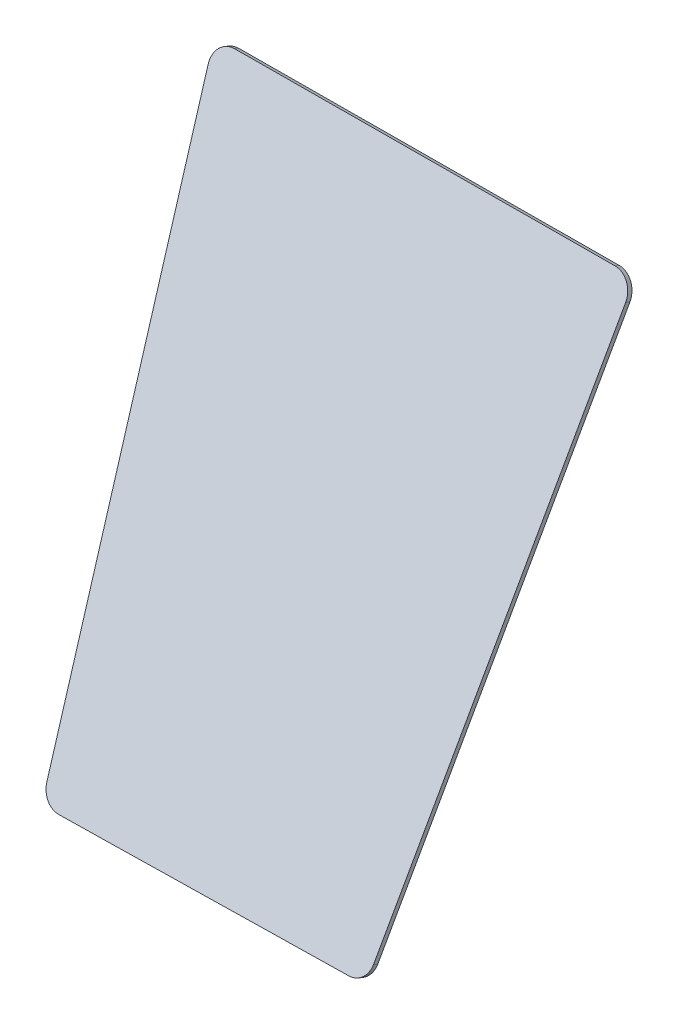
ISO-10303-21;
HEADER;
FILE_DESCRIPTION(('STEP AP214'),'2;1');
FILE_NAME('part.step','',(''),(''),'','','');
FILE_SCHEMA(('AUTOMOTIVE_DESIGN { 1 0 10303 214 1 1 1 1 }'));
ENDSEC;
DATA;
#1=APPLICATION_CONTEXT('core data for automotive mechanical design processes');
#2=APPLICATION_PROTOCOL_DEFINITION('international standard','automotive_design',2000,#1);
#3=PRODUCT_CONTEXT('',#1,'mechanical');
#4=PRODUCT('Part','Part','',(#3));
#5=PRODUCT_RELATED_PRODUCT_CATEGORY('part','',(#4));
#6=PRODUCT_DEFINITION_FORMATION('','',#4);
#7=PRODUCT_DEFINITION_CONTEXT('part definition',#1,'design');
#8=PRODUCT_DEFINITION('design','',#6,#7);
#9=PRODUCT_DEFINITION_SHAPE('','',#8);
#10=(LENGTH_UNIT() NAMED_UNIT(*) SI_UNIT(.MILLI.,.METRE.));
#11=(NAMED_UNIT(*) PLANE_ANGLE_UNIT() SI_UNIT($,.RADIAN.));
#12=(NAMED_UNIT(*) SI_UNIT($,.STERADIAN.) SOLID_ANGLE_UNIT());
#13=UNCERTAINTY_MEASURE_WITH_UNIT(LENGTH_MEASURE(1.E-05),#10,'distance_accuracy_value','');
#14=(GEOMETRIC_REPRESENTATION_CONTEXT(3) GLOBAL_UNCERTAINTY_ASSIGNED_CONTEXT((#13)) GLOBAL_UNIT_ASSIGNED_CONTEXT((#10,
#11,#12)) REPRESENTATION_CONTEXT('',''));
#15=CARTESIAN_POINT('',(0.,0.,0.));
#16=DIRECTION('',(0.,0.,1.));
#17=DIRECTION('',(1.,0.,0.));
#18=AXIS2_PLACEMENT_3D('',#15,#16,#17);
#19=CARTESIAN_POINT('',(110.678400741719,112.140813668601,1095.30690111298));
#20=DIRECTION('',(0.996346290988481,-0.0787889886641014,0.0329600318383585));
#21=DIRECTION('',(0.078831820313899,0.996887929561793,0.));
#22=AXIS2_PLACEMENT_3D('',#19,#20,#21);
#23=PLANE('',#22);
#24=DIRECTION('',(0.0854053185316787,0.919159579003186,-0.384514759005668));
#25=VECTOR('',#24,1.);
#26=CARTESIAN_POINT('',(110.678400741719,113.366124959349,1098.23593461241));
#27=LINE('',#26,#25);
#28=CARTESIAN_POINT('',(111.660031698682,123.930753868301,1093.8164019962));
#29=VERTEX_POINT('',#28);
#30=CARTESIAN_POINT('',(143.144317901316,462.774794833915,952.066767081115));
#31=VERTEX_POINT('',#30);
#32=EDGE_CURVE('E110',#29,#31,#27,.T.);
#33=ORIENTED_EDGE('',*,*,#32,.F.);
#34=DIRECTION('',(0.,0.385924815983597,0.922530236040005));
#35=VECTOR('',#34,1.);
#36=CARTESIAN_POINT('',(111.660031698682,122.705442577553,1090.88736849677));
#37=LINE('',#36,#35);
#38=CARTESIAN_POINT('',(111.660031698682,122.705442577553,1090.88736849677));
#39=VERTEX_POINT('',#38);
#40=EDGE_CURVE('E11',#29,#39,#37,.F.);
#41=ORIENTED_EDGE('',*,*,#40,.T.);
#42=DIRECTION('',(0.0854053185316787,0.919159579003186,-0.384514759005668));
#43=VECTOR('',#42,1.);
#44=CARTESIAN_POINT('',(110.678400741719,112.140813668601,1095.30690111298));
#45=LINE('',#44,#43);
#46=CARTESIAN_POINT('',(143.144317901316,461.549483543167,949.137733581688));
#47=VERTEX_POINT('',#46);
#48=EDGE_CURVE('E160',#39,#47,#45,.T.);
#49=ORIENTED_EDGE('',*,*,#48,.T.);
#50=DIRECTION('',(0.,0.385924815983597,0.922530236040005));
#51=VECTOR('',#50,1.);
#52=CARTESIAN_POINT('',(143.144317901316,461.549483543167,949.137733581688));
#53=LINE('',#52,#51);
#54=EDGE_CURVE('E47',#47,#31,#53,.T.);
#55=ORIENTED_EDGE('',*,*,#54,.T.);
#56=EDGE_LOOP('',(#33,#41,#49,#55));
#57=FACE_BOUND('',#56,.T.);
#58=ADVANCED_FACE('F39',(#57),#23,.T.);
#59=CARTESIAN_POINT('',(-110.678400741719,109.257154964133,1096.51323063087));
#60=DIRECTION('',(0.0141197524233254,-0.922438270224821,0.38588634365075));
#61=DIRECTION('',(0.,-0.385924815983597,-0.922530236040005));
#62=AXIS2_PLACEMENT_3D('',#59,#60,#61);
#63=PLANE('',#62);
#64=DIRECTION('',(0.999900311326836,0.013025898535917,-0.00544916285570541));
#65=VECTOR('',#64,1.);
#66=CARTESIAN_POINT('',(-110.678400741719,110.482466254881,1099.4422641303));
#67=LINE('',#66,#65);
#68=CARTESIAN_POINT('',(-98.8506150869359,110.636549151044,1099.37780617432));
#69=VERTEX_POINT('',#68);
#70=CARTESIAN_POINT('',(99.1857546589042,113.21640799248,1098.29856615621));
#71=VERTEX_POINT('',#70);
#72=EDGE_CURVE('E135',#69,#71,#67,.T.);
#73=ORIENTED_EDGE('',*,*,#72,.F.);
#74=DIRECTION('',(0.,0.385924815983597,0.922530236040005));
#75=VECTOR('',#74,1.);
#76=CARTESIAN_POINT('',(-98.8506150869359,109.411237860296,1096.44877267489));
#77=LINE('',#76,#75);
#78=CARTESIAN_POINT('',(-98.8506150869359,109.411237860296,1096.44877267489));
#79=VERTEX_POINT('',#78);
#80=EDGE_CURVE('E61',#69,#79,#77,.F.);
#81=ORIENTED_EDGE('',*,*,#80,.T.);
#82=DIRECTION('',(0.999900311326836,0.013025898535917,-0.00544916285570541));
#83=VECTOR('',#82,1.);
#84=CARTESIAN_POINT('',(-110.678400741719,109.257154964133,1096.51323063087));
#85=LINE('',#84,#83);
#86=CARTESIAN_POINT('',(99.1857546589042,111.991096701732,1095.36953265679));
#87=VERTEX_POINT('',#86);
#88=EDGE_CURVE('E129',#79,#87,#85,.T.);
#89=ORIENTED_EDGE('',*,*,#88,.T.);
#90=DIRECTION('',(0.,0.385924815983597,0.922530236040005));
#91=VECTOR('',#90,1.);
#92=CARTESIAN_POINT('',(99.1857546589042,111.991096701732,1095.36953265679));
#93=LINE('',#92,#91);
#94=EDGE_CURVE('E154',#87,#71,#93,.T.);
#95=ORIENTED_EDGE('',*,*,#94,.T.);
#96=EDGE_LOOP('',(#73,#81,#89,#95));
#97=FACE_BOUND('',#96,.T.);
#98=ADVANCED_FACE('F192',(#97),#63,.T.);
#99=CARTESIAN_POINT('',(-144.331189967627,473.141874622148,944.28825416173));
#100=DIRECTION('',(-0.996380216090595,-0.0784230196095746,0.0328069349158879));
#101=DIRECTION('',(0.0784652568585438,-0.99691684882247,0.));
#102=AXIS2_PLACEMENT_3D('',#99,#100,#101);
#103=PLANE('',#102);
#104=DIRECTION('',(0.0850086171117907,-0.919190875935648,0.384527851544459));
#105=VECTOR('',#104,1.);
#106=CARTESIAN_POINT('',(-144.331189967627,474.367185912896,947.217287661157));
#107=LINE('',#106,#105);
#108=CARTESIAN_POINT('',(-143.160769442987,461.711529300552,952.511566112382));
#109=VERTEX_POINT('',#108);
#110=CARTESIAN_POINT('',(-111.683964687063,121.355542833858,1094.89369768338));
#111=VERTEX_POINT('',#110);
#112=EDGE_CURVE('E125',#109,#111,#107,.T.);
#113=ORIENTED_EDGE('',*,*,#112,.F.);
#114=DIRECTION('',(0.,0.385924815983597,0.922530236040005));
#115=VECTOR('',#114,1.);
#116=CARTESIAN_POINT('',(-143.160769442987,460.486218009804,949.582532612955));
#117=LINE('',#116,#115);
#118=CARTESIAN_POINT('',(-143.160769442987,460.486218009804,949.582532612955));
#119=VERTEX_POINT('',#118);
#120=EDGE_CURVE('E146',#109,#119,#117,.F.);
#121=ORIENTED_EDGE('',*,*,#120,.T.);
#122=DIRECTION('',(0.0850086171117907,-0.919190875935648,0.384527851544459));
#123=VECTOR('',#122,1.);
#124=CARTESIAN_POINT('',(-144.331189967627,473.141874622148,944.28825416173));
#125=LINE('',#124,#123);
#126=CARTESIAN_POINT('',(-111.683964687063,120.13023154311,1091.96466418396));
#127=VERTEX_POINT('',#126);
#128=EDGE_CURVE('E132',#119,#127,#125,.T.);
#129=ORIENTED_EDGE('',*,*,#128,.T.);
#130=DIRECTION('',(0.,0.385924815983597,0.922530236040005));
#131=VECTOR('',#130,1.);
#132=CARTESIAN_POINT('',(-111.683964687063,120.13023154311,1091.96466418396));
#133=LINE('',#132,#131);
#134=EDGE_CURVE('E143',#127,#111,#133,.T.);
#135=ORIENTED_EDGE('',*,*,#134,.T.);
#136=EDGE_LOOP('',(#113,#121,#129,#135));
#137=FACE_BOUND('',#136,.T.);
#138=ADVANCED_FACE('F172',(#137),#103,.T.);
#139=CARTESIAN_POINT('',(144.331189967627,474.322983455774,943.79415739236));
#140=DIRECTION('',(-0.00443521675280644,0.922521162381143,-0.385921020172912));
#141=DIRECTION('',(0.,0.385924815983597,0.922530236040005));
#142=AXIS2_PLACEMENT_3D('',#139,#140,#141);
#143=PLANE('',#142);
#144=DIRECTION('',(-0.999990164377808,-0.00409162155785511,0.00171166020917419));
#145=VECTOR('',#144,1.);
#146=CARTESIAN_POINT('',(144.331189967627,474.322983455774,943.79415739236));
#147=LINE('',#146,#145);
#148=CARTESIAN_POINT('',(130.434392753002,474.266122461442,943.817944221145));
#149=VERTEX_POINT('',#148);
#150=CARTESIAN_POINT('',(-130.563067951397,473.198209121086,944.264687583327));
#151=VERTEX_POINT('',#150);
#152=EDGE_CURVE('E161',#149,#151,#147,.T.);
#153=ORIENTED_EDGE('',*,*,#152,.T.);
#154=DIRECTION('',(0.,0.385924815983597,0.922530236040005));
#155=VECTOR('',#154,1.);
#156=CARTESIAN_POINT('',(-130.563067951397,473.198209121086,944.264687583327));
#157=LINE('',#156,#155);
#158=CARTESIAN_POINT('',(-130.563067951397,474.423520411834,947.193721082754));
#159=VERTEX_POINT('',#158);
#160=EDGE_CURVE('E116',#151,#159,#157,.T.);
#161=ORIENTED_EDGE('',*,*,#160,.T.);
#162=DIRECTION('',(-0.999990164377808,-0.00409162155785511,0.00171166020917419));
#163=VECTOR('',#162,1.);
#164=CARTESIAN_POINT('',(144.331189967627,475.548294746521,946.723190891787));
#165=LINE('',#164,#163);
#166=CARTESIAN_POINT('',(130.434392753002,475.49143375219,946.746977720572));
#167=VERTEX_POINT('',#166);
#168=EDGE_CURVE('E108',#167,#159,#165,.T.);
#169=ORIENTED_EDGE('',*,*,#168,.F.);
#170=DIRECTION('',(0.,0.385924815983597,0.922530236040005));
#171=VECTOR('',#170,1.);
#172=CARTESIAN_POINT('',(130.434392753002,474.266122461442,943.817944221145));
#173=LINE('',#172,#171);
#174=EDGE_CURVE('E122',#167,#149,#173,.F.);
#175=ORIENTED_EDGE('',*,*,#174,.T.);
#176=EDGE_LOOP('',(#153,#161,#169,#175));
#177=FACE_BOUND('',#176,.T.);
#178=ADVANCED_FACE('F121',(#177),#143,.T.);
#179=CARTESIAN_POINT('',(0.,406.661195784957,972.099314162147));
#180=DIRECTION('',(0.,0.385924815983597,0.922530236040005));
#181=DIRECTION('',(0.,-0.922530236040005,0.385924815983597));
#182=AXIS2_PLACEMENT_3D('',#179,#180,#181);
#183=PLANE('',#182);
#184=ORIENTED_EDGE('',*,*,#128,.F.);
#185=CARTESIAN_POINT('',(-130.506740698636,461.482190358846,949.165884539523));
#186=DIRECTION('',(0.,0.385924815983597,0.922530236040005));
#187=DIRECTION('',(0.,-0.922530236040005,0.385924815983597));
#188=AXIS2_PLACEMENT_3D('',#185,#186,#187);
#189=CIRCLE('',#188,12.7);
#190=EDGE_CURVE('E152',#119,#151,#189,.F.);
#191=ORIENTED_EDGE('',*,*,#190,.T.);
#192=ORIENTED_EDGE('',*,*,#152,.F.);
#193=CARTESIAN_POINT('',(130.490720005763,462.550103699201,948.719141177341));
#194=DIRECTION('',(0.,0.385924815983597,0.922530236040005));
#195=DIRECTION('',(0.,-0.922530236040005,0.385924815983597));
#196=AXIS2_PLACEMENT_3D('',#193,#194,#195);
#197=CIRCLE('',#196,12.7);
#198=EDGE_CURVE('E128',#149,#47,#197,.F.);
#199=ORIENTED_EDGE('',*,*,#198,.T.);
#200=ORIENTED_EDGE('',*,*,#48,.F.);
#201=CARTESIAN_POINT('',(99.006433803128,123.706062733587,1090.46877609242));
#202=DIRECTION('',(0.,0.385924815983597,0.922530236040005));
#203=DIRECTION('',(0.,-0.922530236040005,0.385924815983597));
#204=AXIS2_PLACEMENT_3D('',#201,#202,#203);
#205=CIRCLE('',#204,12.7);
#206=EDGE_CURVE('E54',#39,#87,#205,.F.);
#207=ORIENTED_EDGE('',*,*,#206,.T.);
#208=ORIENTED_EDGE('',*,*,#88,.F.);
#209=CARTESIAN_POINT('',(-99.0299359427121,121.126203892151,1091.54801611052));
#210=DIRECTION('',(0.,0.385924815983597,0.922530236040005));
#211=DIRECTION('',(0.,-0.922530236040005,0.385924815983597));
#212=AXIS2_PLACEMENT_3D('',#209,#210,#211);
#213=CIRCLE('',#212,12.7);
#214=EDGE_CURVE('E150',#79,#127,#213,.F.);
#215=ORIENTED_EDGE('',*,*,#214,.T.);
#216=EDGE_LOOP('',(#184,#191,#192,#199,#200,#207,#208,#215));
#217=FACE_BOUND('',#216,.T.);
#218=ADVANCED_FACE('F178',(#217),#183,.F.);
#219=CARTESIAN_POINT('',(0.,407.886507075705,975.028347661574));
#220=DIRECTION('',(0.,0.385924815983597,0.922530236040005));
#221=DIRECTION('',(0.,-0.922530236040005,0.385924815983597));
#222=AXIS2_PLACEMENT_3D('',#219,#220,#221);
#223=PLANE('',#222);
#224=ORIENTED_EDGE('',*,*,#168,.T.);
#225=CARTESIAN_POINT('',(-130.506740698636,462.707501649594,952.09491803895));
#226=DIRECTION('',(0.,0.385924815983597,0.922530236040005));
#227=DIRECTION('',(0.,-0.922530236040005,0.385924815983597));
#228=AXIS2_PLACEMENT_3D('',#225,#226,#227);
#229=CIRCLE('',#228,12.7);
#230=EDGE_CURVE('E141',#159,#109,#229,.T.);
#231=ORIENTED_EDGE('',*,*,#230,.T.);
#232=ORIENTED_EDGE('',*,*,#112,.T.);
#233=CARTESIAN_POINT('',(-99.0299359427121,122.351515182899,1094.47704960995));
#234=DIRECTION('',(0.,0.385924815983597,0.922530236040005));
#235=DIRECTION('',(0.,-0.922530236040005,0.385924815983597));
#236=AXIS2_PLACEMENT_3D('',#233,#234,#235);
#237=CIRCLE('',#236,12.7);
#238=EDGE_CURVE('E139',#111,#69,#237,.T.);
#239=ORIENTED_EDGE('',*,*,#238,.T.);
#240=ORIENTED_EDGE('',*,*,#72,.T.);
#241=CARTESIAN_POINT('',(99.006433803128,124.931374024335,1093.39780959185));
#242=DIRECTION('',(0.,0.385924815983597,0.922530236040005));
#243=DIRECTION('',(0.,-0.922530236040005,0.385924815983597));
#244=AXIS2_PLACEMENT_3D('',#241,#242,#243);
#245=CIRCLE('',#244,12.7);
#246=EDGE_CURVE('E115',#71,#29,#245,.T.);
#247=ORIENTED_EDGE('',*,*,#246,.T.);
#248=ORIENTED_EDGE('',*,*,#32,.T.);
#249=CARTESIAN_POINT('',(130.490720005763,463.775414989949,951.648174676768));
#250=DIRECTION('',(0.,0.385924815983597,0.922530236040005));
#251=DIRECTION('',(0.,-0.922530236040005,0.385924815983597));
#252=AXIS2_PLACEMENT_3D('',#249,#250,#251);
#253=CIRCLE('',#252,12.7);
#254=EDGE_CURVE('E105',#31,#167,#253,.T.);
#255=ORIENTED_EDGE('',*,*,#254,.T.);
#256=EDGE_LOOP('',(#224,#231,#232,#239,#240,#247,#248,#255));
#257=FACE_BOUND('',#256,.T.);
#258=ADVANCED_FACE('F107',(#257),#223,.T.);
#259=CARTESIAN_POINT('',(-130.506740698636,461.482190358846,949.165884539523));
#260=DIRECTION('',(0.,0.385924815983597,0.922530236040005));
#261=DIRECTION('',(0.,-0.922530236040005,0.385924815983597));
#262=AXIS2_PLACEMENT_3D('',#259,#260,#261);
#263=CYLINDRICAL_SURFACE('',#262,12.7);
#264=ORIENTED_EDGE('',*,*,#190,.F.);
#265=ORIENTED_EDGE('',*,*,#120,.F.);
#266=ORIENTED_EDGE('',*,*,#230,.F.);
#267=ORIENTED_EDGE('',*,*,#160,.F.);
#268=EDGE_LOOP('',(#264,#265,#266,#267));
#269=FACE_BOUND('',#268,.T.);
#270=ADVANCED_FACE('F177',(#269),#263,.T.);
#271=CARTESIAN_POINT('',(-99.0299359427121,121.126203892151,1091.54801611052));
#272=DIRECTION('',(0.,0.385924815983597,0.922530236040005));
#273=DIRECTION('',(0.,-0.922530236040005,0.385924815983597));
#274=AXIS2_PLACEMENT_3D('',#271,#272,#273);
#275=CYLINDRICAL_SURFACE('',#274,12.7);
#276=ORIENTED_EDGE('',*,*,#214,.F.);
#277=ORIENTED_EDGE('',*,*,#80,.F.);
#278=ORIENTED_EDGE('',*,*,#238,.F.);
#279=ORIENTED_EDGE('',*,*,#134,.F.);
#280=EDGE_LOOP('',(#276,#277,#278,#279));
#281=FACE_BOUND('',#280,.T.);
#282=ADVANCED_FACE('F181',(#281),#275,.T.);
#283=CARTESIAN_POINT('',(99.006433803128,123.706062733587,1090.46877609242));
#284=DIRECTION('',(0.,0.385924815983597,0.922530236040005));
#285=DIRECTION('',(0.,-0.922530236040005,0.385924815983597));
#286=AXIS2_PLACEMENT_3D('',#283,#284,#285);
#287=CYLINDRICAL_SURFACE('',#286,12.7);
#288=ORIENTED_EDGE('',*,*,#206,.F.);
#289=ORIENTED_EDGE('',*,*,#40,.F.);
#290=ORIENTED_EDGE('',*,*,#246,.F.);
#291=ORIENTED_EDGE('',*,*,#94,.F.);
#292=EDGE_LOOP('',(#288,#289,#290,#291));
#293=FACE_BOUND('',#292,.T.);
#294=ADVANCED_FACE('F183',(#293),#287,.T.);
#295=CARTESIAN_POINT('',(130.490720005763,462.550103699201,948.719141177341));
#296=DIRECTION('',(0.,0.385924815983597,0.922530236040005));
#297=DIRECTION('',(0.,-0.922530236040005,0.385924815983597));
#298=AXIS2_PLACEMENT_3D('',#295,#296,#297);
#299=CYLINDRICAL_SURFACE('',#298,12.7);
#300=ORIENTED_EDGE('',*,*,#198,.F.);
#301=ORIENTED_EDGE('',*,*,#174,.F.);
#302=ORIENTED_EDGE('',*,*,#254,.F.);
#303=ORIENTED_EDGE('',*,*,#54,.F.);
#304=EDGE_LOOP('',(#300,#301,#302,#303));
#305=FACE_BOUND('',#304,.T.);
#306=ADVANCED_FACE('F41',(#305),#299,.T.);
#307=CLOSED_SHELL('',(#58,#98,#138,#178,#218,#258,#270,#282,#294,#306));
#308=MANIFOLD_SOLID_BREP('B2',#307);
#309=ADVANCED_BREP_SHAPE_REPRESENTATION('',(#18,#308),#14);
#310=SHAPE_DEFINITION_REPRESENTATION(#9,#309);
ENDSEC;
END-ISO-10303-21;
